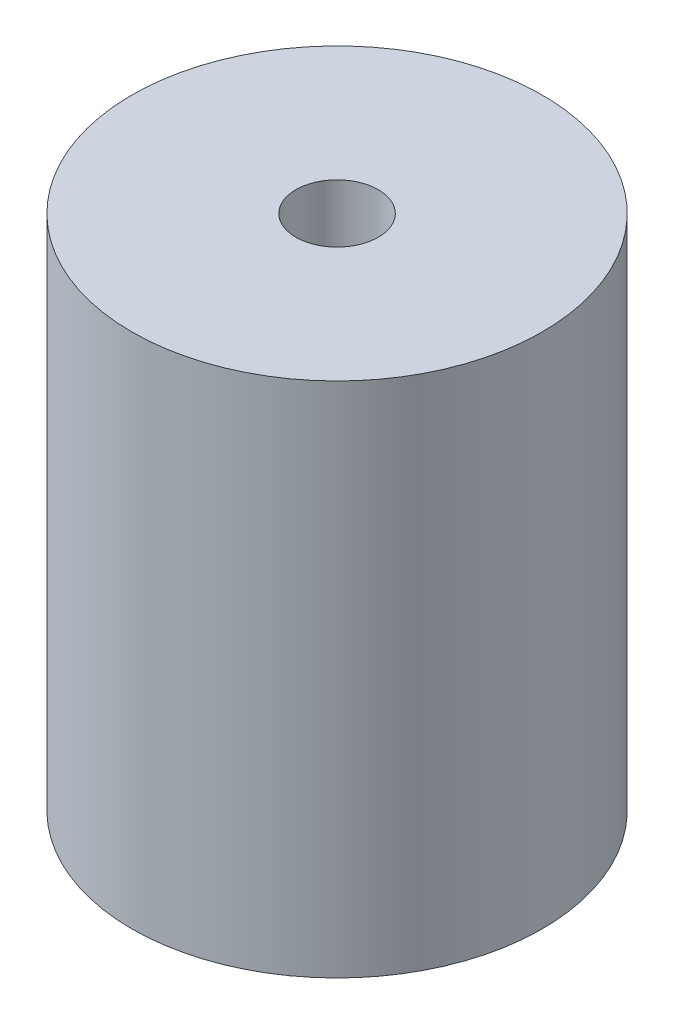
ISO-10303-21;
HEADER;
FILE_DESCRIPTION(('STEP AP214'),'2;1');
FILE_NAME('part.step','',(''),(''),'','','');
FILE_SCHEMA(('AUTOMOTIVE_DESIGN { 1 0 10303 214 1 1 1 1 }'));
ENDSEC;
DATA;
#1=APPLICATION_CONTEXT('core data for automotive mechanical design processes');
#2=APPLICATION_PROTOCOL_DEFINITION('international standard','automotive_design',2000,#1);
#3=PRODUCT_CONTEXT('',#1,'mechanical');
#4=PRODUCT('Part','Part','',(#3));
#5=PRODUCT_RELATED_PRODUCT_CATEGORY('part','',(#4));
#6=PRODUCT_DEFINITION_FORMATION('','',#4);
#7=PRODUCT_DEFINITION_CONTEXT('part definition',#1,'design');
#8=PRODUCT_DEFINITION('design','',#6,#7);
#9=PRODUCT_DEFINITION_SHAPE('','',#8);
#10=(LENGTH_UNIT() NAMED_UNIT(*) SI_UNIT(.MILLI.,.METRE.));
#11=(NAMED_UNIT(*) PLANE_ANGLE_UNIT() SI_UNIT($,.RADIAN.));
#12=(NAMED_UNIT(*) SI_UNIT($,.STERADIAN.) SOLID_ANGLE_UNIT());
#13=UNCERTAINTY_MEASURE_WITH_UNIT(LENGTH_MEASURE(1.E-05),#10,'distance_accuracy_value','');
#14=(GEOMETRIC_REPRESENTATION_CONTEXT(3) GLOBAL_UNCERTAINTY_ASSIGNED_CONTEXT((#13)) GLOBAL_UNIT_ASSIGNED_CONTEXT((#10,
#11,#12)) REPRESENTATION_CONTEXT('',''));
#15=CARTESIAN_POINT('',(0.,0.,0.));
#16=DIRECTION('',(0.,0.,1.));
#17=DIRECTION('',(1.,0.,0.));
#18=AXIS2_PLACEMENT_3D('',#15,#16,#17);
#19=CARTESIAN_POINT('',(0.,32.,0.));
#20=DIRECTION('',(0.,-1.,0.));
#21=DIRECTION('',(0.,0.,-1.));
#22=AXIS2_PLACEMENT_3D('',#19,#20,#21);
#23=CYLINDRICAL_SURFACE('',#22,12.7);
#24=CARTESIAN_POINT('',(0.,32.,0.));
#25=DIRECTION('',(0.,1.,0.));
#26=DIRECTION('',(0.,0.,1.));
#27=AXIS2_PLACEMENT_3D('',#24,#25,#26);
#28=CIRCLE('',#27,12.7);
#29=CARTESIAN_POINT('',(0.,32.,12.7));
#30=VERTEX_POINT('',#29);
#31=EDGE_CURVE('E11',#30,#30,#28,.T.);
#32=ORIENTED_EDGE('',*,*,#31,.F.);
#33=EDGE_LOOP('',(#32));
#34=FACE_BOUND('',#33,.T.);
#35=CARTESIAN_POINT('',(0.,0.,0.));
#36=DIRECTION('',(0.,1.,0.));
#37=DIRECTION('',(0.,0.,1.));
#38=AXIS2_PLACEMENT_3D('',#35,#36,#37);
#39=CIRCLE('',#38,12.7);
#40=CARTESIAN_POINT('',(0.,0.,12.7));
#41=VERTEX_POINT('',#40);
#42=EDGE_CURVE('E42',#41,#41,#39,.T.);
#43=ORIENTED_EDGE('',*,*,#42,.T.);
#44=EDGE_LOOP('',(#43));
#45=FACE_BOUND('',#44,.T.);
#46=ADVANCED_FACE('F39',(#34,#45),#23,.T.);
#47=CARTESIAN_POINT('',(0.,32.,0.));
#48=DIRECTION('',(0.,1.,0.));
#49=DIRECTION('',(0.,0.,1.));
#50=AXIS2_PLACEMENT_3D('',#47,#48,#49);
#51=PLANE('',#50);
#52=CARTESIAN_POINT('',(0.,32.,0.));
#53=DIRECTION('',(0.,1.,0.));
#54=DIRECTION('',(0.,0.,1.));
#55=AXIS2_PLACEMENT_3D('',#52,#53,#54);
#56=CIRCLE('',#55,2.55269999999999);
#57=CARTESIAN_POINT('',(0.,32.,2.55269999999999));
#58=VERTEX_POINT('',#57);
#59=EDGE_CURVE('E63',#58,#58,#56,.T.);
#60=ORIENTED_EDGE('',*,*,#59,.F.);
#61=EDGE_LOOP('',(#60));
#62=FACE_BOUND('',#61,.T.);
#63=ORIENTED_EDGE('',*,*,#31,.T.);
#64=EDGE_LOOP('',(#63));
#65=FACE_BOUND('',#64,.T.);
#66=ADVANCED_FACE('F81',(#62,#65),#51,.T.);
#67=CARTESIAN_POINT('',(0.,0.,0.));
#68=DIRECTION('',(0.,1.,0.));
#69=DIRECTION('',(0.,0.,1.));
#70=AXIS2_PLACEMENT_3D('',#67,#68,#69);
#71=PLANE('',#70);
#72=CARTESIAN_POINT('',(0.,0.,0.));
#73=DIRECTION('',(0.,-1.,0.));
#74=DIRECTION('',(0.,0.,-1.));
#75=AXIS2_PLACEMENT_3D('',#72,#73,#74);
#76=CIRCLE('',#75,2.55269999999999);
#77=CARTESIAN_POINT('',(0.,0.,-2.55269999999999));
#78=VERTEX_POINT('',#77);
#79=EDGE_CURVE('E62',#78,#78,#76,.T.);
#80=ORIENTED_EDGE('',*,*,#79,.F.);
#81=EDGE_LOOP('',(#80));
#82=FACE_BOUND('',#81,.T.);
#83=ORIENTED_EDGE('',*,*,#42,.F.);
#84=EDGE_LOOP('',(#83));
#85=FACE_BOUND('',#84,.T.);
#86=ADVANCED_FACE('F78',(#82,#85),#71,.F.);
#87=CARTESIAN_POINT('',(0.,7.62,0.));
#88=DIRECTION('',(0.,-1.,0.));
#89=DIRECTION('',(0.,0.,-1.));
#90=AXIS2_PLACEMENT_3D('',#87,#88,#89);
#91=CONICAL_SURFACE('',#90,2.5527,1.02974425867665);
#92=CARTESIAN_POINT('',(0.,9.15381690219165,0.));
#93=VERTEX_POINT('',#92);
#94=VERTEX_LOOP('',#93);
#95=FACE_BOUND('',#94,.T.);
#96=CARTESIAN_POINT('',(0.,7.62,0.));
#97=DIRECTION('',(0.,-1.,0.));
#98=DIRECTION('',(0.,0.,-1.));
#99=AXIS2_PLACEMENT_3D('',#96,#97,#98);
#100=CIRCLE('',#99,2.5527);
#101=CARTESIAN_POINT('',(0.,7.62,-2.5527));
#102=VERTEX_POINT('',#101);
#103=EDGE_CURVE('E66',#102,#102,#100,.T.);
#104=ORIENTED_EDGE('',*,*,#103,.T.);
#105=EDGE_LOOP('',(#104));
#106=FACE_BOUND('',#105,.T.);
#107=ADVANCED_FACE('F80',(#95,#106),#91,.F.);
#108=CARTESIAN_POINT('',(0.,0.,0.));
#109=DIRECTION('',(0.,-1.,0.));
#110=DIRECTION('',(0.,0.,-1.));
#111=AXIS2_PLACEMENT_3D('',#108,#109,#110);
#112=CYLINDRICAL_SURFACE('',#111,2.55269999999999);
#113=ORIENTED_EDGE('',*,*,#103,.F.);
#114=EDGE_LOOP('',(#113));
#115=FACE_BOUND('',#114,.T.);
#116=ORIENTED_EDGE('',*,*,#79,.T.);
#117=EDGE_LOOP('',(#116));
#118=FACE_BOUND('',#117,.T.);
#119=ADVANCED_FACE('F56',(#115,#118),#112,.F.);
#120=CARTESIAN_POINT('',(0.,24.38,0.));
#121=DIRECTION('',(0.,1.,0.));
#122=DIRECTION('',(0.,0.,1.));
#123=AXIS2_PLACEMENT_3D('',#120,#121,#122);
#124=CONICAL_SURFACE('',#123,2.55269999999999,1.02974425867665);
#125=CARTESIAN_POINT('',(0.,22.8461830978083,0.));
#126=VERTEX_POINT('',#125);
#127=VERTEX_LOOP('',#126);
#128=FACE_BOUND('',#127,.T.);
#129=CARTESIAN_POINT('',(0.,24.38,0.));
#130=DIRECTION('',(0.,1.,0.));
#131=DIRECTION('',(0.,0.,1.));
#132=AXIS2_PLACEMENT_3D('',#129,#130,#131);
#133=CIRCLE('',#132,2.55269999999999);
#134=CARTESIAN_POINT('',(0.,24.38,2.55269999999999));
#135=VERTEX_POINT('',#134);
#136=EDGE_CURVE('E60',#135,#135,#133,.T.);
#137=ORIENTED_EDGE('',*,*,#136,.T.);
#138=EDGE_LOOP('',(#137));
#139=FACE_BOUND('',#138,.T.);
#140=ADVANCED_FACE('F52',(#128,#139),#124,.F.);
#141=CARTESIAN_POINT('',(0.,32.,0.));
#142=DIRECTION('',(0.,1.,0.));
#143=DIRECTION('',(0.,0.,1.));
#144=AXIS2_PLACEMENT_3D('',#141,#142,#143);
#145=CYLINDRICAL_SURFACE('',#144,2.55269999999999);
#146=ORIENTED_EDGE('',*,*,#136,.F.);
#147=EDGE_LOOP('',(#146));
#148=FACE_BOUND('',#147,.T.);
#149=ORIENTED_EDGE('',*,*,#59,.T.);
#150=EDGE_LOOP('',(#149));
#151=FACE_BOUND('',#150,.T.);
#152=ADVANCED_FACE('F55',(#148,#151),#145,.F.);
#153=CLOSED_SHELL('',(#46,#66,#86,#107,#119,#140,#152));
#154=MANIFOLD_SOLID_BREP('B2',#153);
#155=ADVANCED_BREP_SHAPE_REPRESENTATION('',(#18,#154),#14);
#156=SHAPE_DEFINITION_REPRESENTATION(#9,#155);
ENDSEC;
END-ISO-10303-21;
